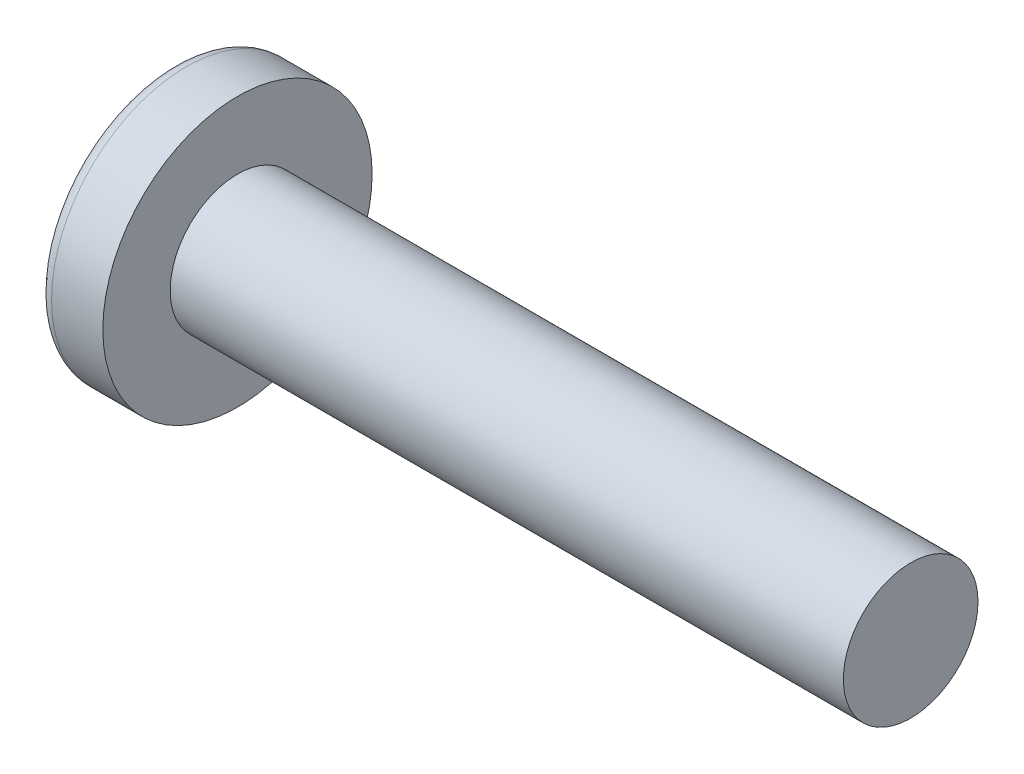
ISO-10303-21;
HEADER;
FILE_DESCRIPTION(('STEP AP214'),'2;1');
FILE_NAME('part.step','',(''),(''),'','','');
FILE_SCHEMA(('AUTOMOTIVE_DESIGN { 1 0 10303 214 1 1 1 1 }'));
ENDSEC;
DATA;
#1=APPLICATION_CONTEXT('core data for automotive mechanical design processes');
#2=APPLICATION_PROTOCOL_DEFINITION('international standard','automotive_design',2000,#1);
#3=PRODUCT_CONTEXT('',#1,'mechanical');
#4=PRODUCT('Part','Part','',(#3));
#5=PRODUCT_RELATED_PRODUCT_CATEGORY('part','',(#4));
#6=PRODUCT_DEFINITION_FORMATION('','',#4);
#7=PRODUCT_DEFINITION_CONTEXT('part definition',#1,'design');
#8=PRODUCT_DEFINITION('design','',#6,#7);
#9=PRODUCT_DEFINITION_SHAPE('','',#8);
#10=(LENGTH_UNIT() NAMED_UNIT(*) SI_UNIT(.MILLI.,.METRE.));
#11=(NAMED_UNIT(*) PLANE_ANGLE_UNIT() SI_UNIT($,.RADIAN.));
#12=(NAMED_UNIT(*) SI_UNIT($,.STERADIAN.) SOLID_ANGLE_UNIT());
#13=UNCERTAINTY_MEASURE_WITH_UNIT(LENGTH_MEASURE(1.E-05),#10,'distance_accuracy_value','');
#14=(GEOMETRIC_REPRESENTATION_CONTEXT(3) GLOBAL_UNCERTAINTY_ASSIGNED_CONTEXT((#13)) GLOBAL_UNIT_ASSIGNED_CONTEXT((#10,
#11,#12)) REPRESENTATION_CONTEXT('',''));
#15=CARTESIAN_POINT('',(0.,0.,0.));
#16=DIRECTION('',(0.,0.,1.));
#17=DIRECTION('',(1.,0.,0.));
#18=AXIS2_PLACEMENT_3D('',#15,#16,#17);
#19=CARTESIAN_POINT('',(0.,0.,-0.5));
#20=DIRECTION('',(0.,0.,-1.));
#21=DIRECTION('',(-1.,0.,0.));
#22=AXIS2_PLACEMENT_3D('',#19,#20,#21);
#23=PLANE('',#22);
#24=DIRECTION('',(1.,0.,0.));
#25=VECTOR('',#24,1.);
#26=CARTESIAN_POINT('',(-23.06142399166,-0.687386354243376,-0.5));
#27=LINE('',#26,#25);
#28=CARTESIAN_POINT('',(-23.0441834238327,-0.687386354243377,-0.5));
#29=VERTEX_POINT('',#28);
#30=CARTESIAN_POINT('',(-20.8,-0.687386354243376,-0.5));
#31=VERTEX_POINT('',#30);
#32=EDGE_CURVE('E283',#29,#31,#27,.T.);
#33=ORIENTED_EDGE('',*,*,#32,.F.);
#34=CARTESIAN_POINT('',(-16.6,0.,-0.5));
#35=DIRECTION('',(0.,0.,-1.));
#36=DIRECTION('',(-1.,0.,0.));
#37=AXIS2_PLACEMENT_3D('',#34,#35,#36);
#38=CIRCLE('',#37,6.48074069840786);
#39=CARTESIAN_POINT('',(-22.7701369230687,-1.98227403518901,-0.5));
#40=VERTEX_POINT('',#39);
#41=EDGE_CURVE('E256',#29,#40,#38,.F.);
#42=ORIENTED_EDGE('',*,*,#41,.T.);
#43=DIRECTION('',(0.894934361602028,0.446197813109803,0.));
#44=VECTOR('',#43,1.);
#45=CARTESIAN_POINT('',(-20.8,-1.,-0.5));
#46=LINE('',#45,#44);
#47=CARTESIAN_POINT('',(-20.8,-1.,-0.5));
#48=VERTEX_POINT('',#47);
#49=EDGE_CURVE('E216',#40,#48,#46,.T.);
#50=ORIENTED_EDGE('',*,*,#49,.T.);
#51=DIRECTION('',(0.,1.,0.));
#52=VECTOR('',#51,1.);
#53=CARTESIAN_POINT('',(-20.8,1.,-0.5));
#54=LINE('',#53,#52);
#55=EDGE_CURVE('E209',#48,#31,#54,.T.);
#56=ORIENTED_EDGE('',*,*,#55,.T.);
#57=EDGE_LOOP('',(#33,#42,#50,#56));
#58=FACE_BOUND('',#57,.T.);
#59=ADVANCED_FACE('F41',(#58),#23,.F.);
#60=CARTESIAN_POINT('',(0.,0.,0.5));
#61=DIRECTION('',(0.,0.,-1.));
#62=DIRECTION('',(-1.,0.,0.));
#63=AXIS2_PLACEMENT_3D('',#60,#61,#62);
#64=PLANE('',#63);
#65=CARTESIAN_POINT('',(-16.6,0.,0.5));
#66=DIRECTION('',(0.,0.,-1.));
#67=DIRECTION('',(-1.,0.,0.));
#68=AXIS2_PLACEMENT_3D('',#65,#66,#67);
#69=CIRCLE('',#68,6.48074069840786);
#70=CARTESIAN_POINT('',(-23.0441834238327,-0.687386354243377,0.5));
#71=VERTEX_POINT('',#70);
#72=CARTESIAN_POINT('',(-22.7701369230687,-1.98227403518901,0.5));
#73=VERTEX_POINT('',#72);
#74=EDGE_CURVE('E247',#71,#73,#69,.F.);
#75=ORIENTED_EDGE('',*,*,#74,.F.);
#76=DIRECTION('',(1.,0.,0.));
#77=VECTOR('',#76,1.);
#78=CARTESIAN_POINT('',(-23.06142399166,-0.687386354243376,0.5));
#79=LINE('',#78,#77);
#80=CARTESIAN_POINT('',(-20.8,-0.687386354243376,0.5));
#81=VERTEX_POINT('',#80);
#82=EDGE_CURVE('E189',#71,#81,#79,.T.);
#83=ORIENTED_EDGE('',*,*,#82,.T.);
#84=DIRECTION('',(0.,1.,0.));
#85=VECTOR('',#84,1.);
#86=CARTESIAN_POINT('',(-20.8,1.,0.5));
#87=LINE('',#86,#85);
#88=CARTESIAN_POINT('',(-20.8,-1.,0.5));
#89=VERTEX_POINT('',#88);
#90=EDGE_CURVE('E219',#89,#81,#87,.T.);
#91=ORIENTED_EDGE('',*,*,#90,.F.);
#92=DIRECTION('',(0.894934361602028,0.446197813109803,0.));
#93=VECTOR('',#92,1.);
#94=CARTESIAN_POINT('',(-20.8,-1.,0.5));
#95=LINE('',#94,#93);
#96=EDGE_CURVE('E225',#73,#89,#95,.T.);
#97=ORIENTED_EDGE('',*,*,#96,.F.);
#98=EDGE_LOOP('',(#75,#83,#91,#97));
#99=FACE_BOUND('',#98,.T.);
#100=ADVANCED_FACE('F327',(#99),#64,.T.);
#101=CARTESIAN_POINT('',(-16.6,0.,0.));
#102=DIRECTION('',(1.,0.,0.));
#103=DIRECTION('',(0.,1.,0.));
#104=AXIS2_PLACEMENT_3D('',#101,#102,#103);
#105=SPHERICAL_SURFACE('',#104,6.5);
#106=CARTESIAN_POINT('',(-21.8473422714487,0.,0.));
#107=DIRECTION('',(1.,0.,0.));
#108=DIRECTION('',(0.,0.,-1.));
#109=AXIS2_PLACEMENT_3D('',#106,#107,#108);
#110=CIRCLE('',#109,3.83606557377049);
#111=CARTESIAN_POINT('',(-21.8473422714487,0.,-3.83606557377049));
#112=VERTEX_POINT('',#111);
#113=EDGE_CURVE('E230',#112,#112,#110,.T.);
#114=ORIENTED_EDGE('',*,*,#113,.F.);
#115=EDGE_LOOP('',(#114));
#116=FACE_BOUND('',#115,.T.);
#117=CARTESIAN_POINT('',(-16.6,0.5,0.));
#118=DIRECTION('',(0.,1.,0.));
#119=DIRECTION('',(0.,0.,1.));
#120=AXIS2_PLACEMENT_3D('',#117,#118,#119);
#121=CIRCLE('',#120,6.48074069840786);
#122=CARTESIAN_POINT('',(-23.0441834238327,0.500000000000002,-0.687386354243374));
#123=VERTEX_POINT('',#122);
#124=CARTESIAN_POINT('',(-22.7701369230687,0.500000000000007,-1.98227403518901));
#125=VERTEX_POINT('',#124);
#126=EDGE_CURVE('E208',#123,#125,#121,.F.);
#127=ORIENTED_EDGE('',*,*,#126,.F.);
#128=CARTESIAN_POINT('',(-23.0441834238327,0.,0.));
#129=DIRECTION('',(1.,0.,0.));
#130=DIRECTION('',(0.,0.,-1.));
#131=AXIS2_PLACEMENT_3D('',#128,#129,#130);
#132=CIRCLE('',#131,0.85);
#133=CARTESIAN_POINT('',(-23.0441834238327,0.687386354243375,-0.5));
#134=VERTEX_POINT('',#133);
#135=EDGE_CURVE('E271',#123,#134,#132,.T.);
#136=ORIENTED_EDGE('',*,*,#135,.T.);
#137=CARTESIAN_POINT('',(-22.7701369230687,1.98227403518901,-0.5));
#138=VERTEX_POINT('',#137);
#139=EDGE_CURVE('E257',#138,#134,#38,.F.);
#140=ORIENTED_EDGE('',*,*,#139,.F.);
#141=CARTESIAN_POINT('',(-17.036870696357,-0.876227059523271,0.));
#142=DIRECTION('',(0.446197813109803,0.894934361602028,0.));
#143=DIRECTION('',(-0.894934361602028,0.446197813109803,0.));
#144=AXIS2_PLACEMENT_3D('',#141,#142,#143);
#145=CIRCLE('',#144,6.42583614285516);
#146=CARTESIAN_POINT('',(-22.7701369230687,1.98227403518901,0.5));
#147=VERTEX_POINT('',#146);
#148=EDGE_CURVE('E251',#147,#138,#145,.F.);
#149=ORIENTED_EDGE('',*,*,#148,.F.);
#150=CARTESIAN_POINT('',(-23.0441834238327,0.687386354243375,0.5));
#151=VERTEX_POINT('',#150);
#152=EDGE_CURVE('E248',#147,#151,#69,.F.);
#153=ORIENTED_EDGE('',*,*,#152,.T.);
#154=CARTESIAN_POINT('',(-23.0441834238327,0.499999999999998,0.687386354243378));
#155=VERTEX_POINT('',#154);
#156=EDGE_CURVE('E172',#151,#155,#132,.T.);
#157=ORIENTED_EDGE('',*,*,#156,.T.);
#158=CARTESIAN_POINT('',(-22.7701369230687,0.499999999999993,1.98227403518901));
#159=VERTEX_POINT('',#158);
#160=EDGE_CURVE('E171',#159,#155,#121,.F.);
#161=ORIENTED_EDGE('',*,*,#160,.F.);
#162=CARTESIAN_POINT('',(-17.036870696357,0.,-0.87622705952327));
#163=DIRECTION('',(0.446197813109803,0.,0.894934361602028));
#164=DIRECTION('',(0.894934361602028,0.,-0.446197813109803));
#165=AXIS2_PLACEMENT_3D('',#162,#163,#164);
#166=CIRCLE('',#165,6.42583614285516);
#167=CARTESIAN_POINT('',(-22.7701369230687,-0.500000000000007,1.98227403518901));
#168=VERTEX_POINT('',#167);
#169=EDGE_CURVE('E49',#168,#159,#166,.F.);
#170=ORIENTED_EDGE('',*,*,#169,.F.);
#171=CARTESIAN_POINT('',(-16.6,-0.5,0.));
#172=DIRECTION('',(0.,1.,0.));
#173=DIRECTION('',(0.,0.,1.));
#174=AXIS2_PLACEMENT_3D('',#171,#172,#173);
#175=CIRCLE('',#174,6.48074069840786);
#176=CARTESIAN_POINT('',(-23.0441834238327,-0.500000000000002,0.687386354243374));
#177=VERTEX_POINT('',#176);
#178=EDGE_CURVE('E202',#168,#177,#175,.F.);
#179=ORIENTED_EDGE('',*,*,#178,.T.);
#180=EDGE_CURVE('E272',#177,#71,#132,.T.);
#181=ORIENTED_EDGE('',*,*,#180,.T.);
#182=ORIENTED_EDGE('',*,*,#74,.T.);
#183=CARTESIAN_POINT('',(-17.036870696357,0.87622705952327,0.));
#184=DIRECTION('',(0.446197813109803,-0.894934361602028,0.));
#185=DIRECTION('',(0.894934361602028,0.446197813109803,0.));
#186=AXIS2_PLACEMENT_3D('',#183,#184,#185);
#187=CIRCLE('',#186,6.42583614285516);
#188=EDGE_CURVE('E253',#40,#73,#187,.F.);
#189=ORIENTED_EDGE('',*,*,#188,.F.);
#190=ORIENTED_EDGE('',*,*,#41,.F.);
#191=CARTESIAN_POINT('',(-23.0441834238327,-0.499999999999998,-0.687386354243378));
#192=VERTEX_POINT('',#191);
#193=EDGE_CURVE('E162',#29,#192,#132,.T.);
#194=ORIENTED_EDGE('',*,*,#193,.T.);
#195=CARTESIAN_POINT('',(-22.7701369230687,-0.499999999999993,-1.98227403518901));
#196=VERTEX_POINT('',#195);
#197=EDGE_CURVE('E206',#192,#196,#175,.F.);
#198=ORIENTED_EDGE('',*,*,#197,.T.);
#199=CARTESIAN_POINT('',(-17.036870696357,0.,0.87622705952327));
#200=DIRECTION('',(0.446197813109803,0.,-0.894934361602028));
#201=DIRECTION('',(-0.894934361602028,0.,-0.446197813109803));
#202=AXIS2_PLACEMENT_3D('',#199,#200,#201);
#203=CIRCLE('',#202,6.42583614285516);
#204=EDGE_CURVE('E260',#125,#196,#203,.F.);
#205=ORIENTED_EDGE('',*,*,#204,.F.);
#206=EDGE_LOOP('',(#127,#136,#140,#149,#153,#157,#161,#170,#179,#181,#182,#189,#190,#194,#198,#205));
#207=FACE_BOUND('',#206,.T.);
#208=ADVANCED_FACE('F268',(#116,#207),#105,.T.);
#209=DIRECTION('',(1.,0.,0.));
#210=VECTOR('',#209,1.);
#211=CARTESIAN_POINT('',(-23.06142399166,0.687386354243376,-0.5));
#212=LINE('',#211,#210);
#213=CARTESIAN_POINT('',(-20.8,0.687386354243376,-0.5));
#214=VERTEX_POINT('',#213);
#215=EDGE_CURVE('E173',#214,#134,#212,.F.);
#216=ORIENTED_EDGE('',*,*,#215,.F.);
#217=CARTESIAN_POINT('',(-20.8,1.,-0.5));
#218=VERTEX_POINT('',#217);
#219=EDGE_CURVE('E213',#214,#218,#54,.T.);
#220=ORIENTED_EDGE('',*,*,#219,.T.);
#221=DIRECTION('',(-0.894934361602028,0.446197813109803,0.));
#222=VECTOR('',#221,1.);
#223=CARTESIAN_POINT('',(-20.8,1.,-0.5));
#224=LINE('',#223,#222);
#225=EDGE_CURVE('E212',#218,#138,#224,.T.);
#226=ORIENTED_EDGE('',*,*,#225,.T.);
#227=ORIENTED_EDGE('',*,*,#139,.T.);
#228=EDGE_LOOP('',(#216,#220,#226,#227));
#229=FACE_BOUND('',#228,.T.);
#230=ADVANCED_FACE('F298',(#229),#23,.F.);
#231=CARTESIAN_POINT('',(-20.8,0.687386354243376,0.5));
#232=VERTEX_POINT('',#231);
#233=CARTESIAN_POINT('',(-20.8,1.,0.5));
#234=VERTEX_POINT('',#233);
#235=EDGE_CURVE('E222',#232,#234,#87,.T.);
#236=ORIENTED_EDGE('',*,*,#235,.F.);
#237=DIRECTION('',(1.,0.,0.));
#238=VECTOR('',#237,1.);
#239=CARTESIAN_POINT('',(-23.06142399166,0.687386354243376,0.5));
#240=LINE('',#239,#238);
#241=EDGE_CURVE('E159',#232,#151,#240,.F.);
#242=ORIENTED_EDGE('',*,*,#241,.T.);
#243=ORIENTED_EDGE('',*,*,#152,.F.);
#244=DIRECTION('',(-0.894934361602028,0.446197813109803,0.));
#245=VECTOR('',#244,1.);
#246=CARTESIAN_POINT('',(-20.8,1.,0.5));
#247=LINE('',#246,#245);
#248=EDGE_CURVE('E221',#234,#147,#247,.T.);
#249=ORIENTED_EDGE('',*,*,#248,.F.);
#250=EDGE_LOOP('',(#236,#242,#243,#249));
#251=FACE_BOUND('',#250,.T.);
#252=ADVANCED_FACE('F305',(#251),#64,.T.);
#253=CARTESIAN_POINT('',(0.,-0.5,0.));
#254=DIRECTION('',(0.,1.,0.));
#255=DIRECTION('',(-1.,0.,0.));
#256=AXIS2_PLACEMENT_3D('',#253,#254,#255);
#257=PLANE('',#256);
#258=DIRECTION('',(0.,0.,1.));
#259=VECTOR('',#258,1.);
#260=CARTESIAN_POINT('',(-20.8,-0.500000000000003,0.999999999999998));
#261=LINE('',#260,#259);
#262=CARTESIAN_POINT('',(-20.8,-0.500000000000002,0.687386354243374));
#263=VERTEX_POINT('',#262);
#264=CARTESIAN_POINT('',(-20.8,-0.500000000000003,0.999999999999998));
#265=VERTEX_POINT('',#264);
#266=EDGE_CURVE('E196',#263,#265,#261,.T.);
#267=ORIENTED_EDGE('',*,*,#266,.F.);
#268=DIRECTION('',(1.,0.,0.));
#269=VECTOR('',#268,1.);
#270=CARTESIAN_POINT('',(-23.06142399166,-0.500000000000002,0.687386354243374));
#271=LINE('',#270,#269);
#272=EDGE_CURVE('E273',#263,#177,#271,.F.);
#273=ORIENTED_EDGE('',*,*,#272,.T.);
#274=ORIENTED_EDGE('',*,*,#178,.F.);
#275=DIRECTION('',(-0.894934361602028,0.,0.446197813109803));
#276=VECTOR('',#275,1.);
#277=CARTESIAN_POINT('',(-20.8,-0.500000000000003,0.999999999999998));
#278=LINE('',#277,#276);
#279=EDGE_CURVE('E185',#265,#168,#278,.T.);
#280=ORIENTED_EDGE('',*,*,#279,.F.);
#281=EDGE_LOOP('',(#267,#273,#274,#280));
#282=FACE_BOUND('',#281,.T.);
#283=ADVANCED_FACE('F332',(#282),#257,.T.);
#284=CARTESIAN_POINT('',(0.,0.5,0.));
#285=DIRECTION('',(0.,1.,0.));
#286=DIRECTION('',(-1.,0.,0.));
#287=AXIS2_PLACEMENT_3D('',#284,#285,#286);
#288=PLANE('',#287);
#289=DIRECTION('',(1.,0.,0.));
#290=VECTOR('',#289,1.);
#291=CARTESIAN_POINT('',(-23.06142399166,0.499999999999998,0.687386354243378));
#292=LINE('',#291,#290);
#293=CARTESIAN_POINT('',(-20.8,0.499999999999998,0.687386354243378));
#294=VERTEX_POINT('',#293);
#295=EDGE_CURVE('E156',#294,#155,#292,.F.);
#296=ORIENTED_EDGE('',*,*,#295,.F.);
#297=DIRECTION('',(0.,0.,1.));
#298=VECTOR('',#297,1.);
#299=CARTESIAN_POINT('',(-20.8,0.499999999999997,1.));
#300=LINE('',#299,#298);
#301=CARTESIAN_POINT('',(-20.8,0.499999999999997,1.));
#302=VERTEX_POINT('',#301);
#303=EDGE_CURVE('E168',#294,#302,#300,.T.);
#304=ORIENTED_EDGE('',*,*,#303,.T.);
#305=DIRECTION('',(-0.894934361602028,0.,0.446197813109803));
#306=VECTOR('',#305,1.);
#307=CARTESIAN_POINT('',(-20.8,0.499999999999997,1.));
#308=LINE('',#307,#306);
#309=EDGE_CURVE('E184',#302,#159,#308,.T.);
#310=ORIENTED_EDGE('',*,*,#309,.T.);
#311=ORIENTED_EDGE('',*,*,#160,.T.);
#312=EDGE_LOOP('',(#296,#304,#310,#311));
#313=FACE_BOUND('',#312,.T.);
#314=ADVANCED_FACE('F166',(#313),#288,.F.);
#315=DIRECTION('',(1.,0.,0.));
#316=VECTOR('',#315,1.);
#317=CARTESIAN_POINT('',(-23.06142399166,0.500000000000002,-0.687386354243374));
#318=LINE('',#317,#316);
#319=CARTESIAN_POINT('',(-20.8,0.500000000000002,-0.687386354243374));
#320=VERTEX_POINT('',#319);
#321=EDGE_CURVE('E277',#123,#320,#318,.T.);
#322=ORIENTED_EDGE('',*,*,#321,.F.);
#323=ORIENTED_EDGE('',*,*,#126,.T.);
#324=DIRECTION('',(0.894934361602028,0.,0.446197813109803));
#325=VECTOR('',#324,1.);
#326=CARTESIAN_POINT('',(-20.8,0.500000000000003,-0.999999999999998));
#327=LINE('',#326,#325);
#328=CARTESIAN_POINT('',(-20.8,0.500000000000003,-0.999999999999998));
#329=VERTEX_POINT('',#328);
#330=EDGE_CURVE('E192',#125,#329,#327,.T.);
#331=ORIENTED_EDGE('',*,*,#330,.T.);
#332=EDGE_CURVE('E180',#329,#320,#300,.T.);
#333=ORIENTED_EDGE('',*,*,#332,.T.);
#334=EDGE_LOOP('',(#322,#323,#331,#333));
#335=FACE_BOUND('',#334,.T.);
#336=ADVANCED_FACE('F308',(#335),#288,.F.);
#337=ORIENTED_EDGE('',*,*,#197,.F.);
#338=DIRECTION('',(1.,0.,0.));
#339=VECTOR('',#338,1.);
#340=CARTESIAN_POINT('',(-23.06142399166,-0.499999999999998,-0.687386354243378));
#341=LINE('',#340,#339);
#342=CARTESIAN_POINT('',(-20.8,-0.499999999999998,-0.687386354243378));
#343=VERTEX_POINT('',#342);
#344=EDGE_CURVE('E11',#192,#343,#341,.T.);
#345=ORIENTED_EDGE('',*,*,#344,.T.);
#346=CARTESIAN_POINT('',(-20.8,-0.499999999999997,-1.));
#347=VERTEX_POINT('',#346);
#348=EDGE_CURVE('E194',#347,#343,#261,.T.);
#349=ORIENTED_EDGE('',*,*,#348,.F.);
#350=DIRECTION('',(0.894934361602028,0.,0.446197813109803));
#351=VECTOR('',#350,1.);
#352=CARTESIAN_POINT('',(-20.8,-0.499999999999997,-1.));
#353=LINE('',#352,#351);
#354=EDGE_CURVE('E181',#196,#347,#353,.T.);
#355=ORIENTED_EDGE('',*,*,#354,.F.);
#356=EDGE_LOOP('',(#337,#345,#349,#355));
#357=FACE_BOUND('',#356,.T.);
#358=ADVANCED_FACE('F314',(#357),#257,.T.);
#359=CARTESIAN_POINT('',(0.,0.,0.));
#360=DIRECTION('',(1.,0.,0.));
#361=DIRECTION('',(0.,0.,-1.));
#362=AXIS2_PLACEMENT_3D('',#359,#360,#361);
#363=PLANE('',#362);
#364=CARTESIAN_POINT('',(0.,0.,0.));
#365=DIRECTION('',(1.,0.,0.));
#366=DIRECTION('',(0.,0.,-1.));
#367=AXIS2_PLACEMENT_3D('',#364,#365,#366);
#368=CIRCLE('',#367,2.);
#369=CARTESIAN_POINT('',(0.,0.,-2.));
#370=VERTEX_POINT('',#369);
#371=EDGE_CURVE('E244',#370,#370,#368,.T.);
#372=ORIENTED_EDGE('',*,*,#371,.T.);
#373=EDGE_LOOP('',(#372));
#374=FACE_BOUND('',#373,.T.);
#375=ADVANCED_FACE('F43',(#374),#363,.T.);
#376=CARTESIAN_POINT('',(0.,0.,0.));
#377=DIRECTION('',(1.,0.,0.));
#378=DIRECTION('',(0.,0.,-1.));
#379=AXIS2_PLACEMENT_3D('',#376,#377,#378);
#380=CYLINDRICAL_SURFACE('',#379,2.);
#381=CARTESIAN_POINT('',(-20.,0.,0.));
#382=DIRECTION('',(1.,0.,0.));
#383=DIRECTION('',(0.,0.,-1.));
#384=AXIS2_PLACEMENT_3D('',#381,#382,#383);
#385=CIRCLE('',#384,2.);
#386=CARTESIAN_POINT('',(-20.,0.,-2.));
#387=VERTEX_POINT('',#386);
#388=EDGE_CURVE('E241',#387,#387,#385,.T.);
#389=ORIENTED_EDGE('',*,*,#388,.T.);
#390=EDGE_LOOP('',(#389));
#391=FACE_BOUND('',#390,.T.);
#392=ORIENTED_EDGE('',*,*,#371,.F.);
#393=EDGE_LOOP('',(#392));
#394=FACE_BOUND('',#393,.T.);
#395=ADVANCED_FACE('F371',(#391,#394),#380,.T.);
#396=CARTESIAN_POINT('',(-20.,2.,0.));
#397=DIRECTION('',(1.,0.,0.));
#398=DIRECTION('',(0.,0.,-1.));
#399=AXIS2_PLACEMENT_3D('',#396,#397,#398);
#400=PLANE('',#399);
#401=CARTESIAN_POINT('',(-20.,0.,0.));
#402=DIRECTION('',(1.,0.,0.));
#403=DIRECTION('',(0.,0.,-1.));
#404=AXIS2_PLACEMENT_3D('',#401,#402,#403);
#405=CIRCLE('',#404,4.);
#406=CARTESIAN_POINT('',(-20.,0.,-4.));
#407=VERTEX_POINT('',#406);
#408=EDGE_CURVE('E238',#407,#407,#405,.T.);
#409=ORIENTED_EDGE('',*,*,#408,.T.);
#410=EDGE_LOOP('',(#409));
#411=FACE_BOUND('',#410,.T.);
#412=ORIENTED_EDGE('',*,*,#388,.F.);
#413=EDGE_LOOP('',(#412));
#414=FACE_BOUND('',#413,.T.);
#415=ADVANCED_FACE('F368',(#411,#414),#400,.T.);
#416=CARTESIAN_POINT('',(0.,0.,0.));
#417=DIRECTION('',(1.,0.,0.));
#418=DIRECTION('',(0.,0.,-1.));
#419=AXIS2_PLACEMENT_3D('',#416,#417,#418);
#420=CYLINDRICAL_SURFACE('',#419,4.);
#421=CARTESIAN_POINT('',(-21.5244289008981,0.,0.));
#422=DIRECTION('',(1.,0.,0.));
#423=DIRECTION('',(0.,0.,-1.));
#424=AXIS2_PLACEMENT_3D('',#421,#422,#423);
#425=CIRCLE('',#424,4.);
#426=CARTESIAN_POINT('',(-21.5244289008981,0.,-4.));
#427=VERTEX_POINT('',#426);
#428=EDGE_CURVE('E235',#427,#427,#425,.T.);
#429=ORIENTED_EDGE('',*,*,#428,.T.);
#430=EDGE_LOOP('',(#429));
#431=FACE_BOUND('',#430,.T.);
#432=ORIENTED_EDGE('',*,*,#408,.F.);
#433=EDGE_LOOP('',(#432));
#434=FACE_BOUND('',#433,.T.);
#435=ADVANCED_FACE('F364',(#431,#434),#420,.T.);
#436=CARTESIAN_POINT('',(-21.5244289008981,0.,0.));
#437=DIRECTION('',(1.,0.,0.));
#438=DIRECTION('',(0.,0.,-1.));
#439=AXIS2_PLACEMENT_3D('',#436,#437,#438);
#440=TOROIDAL_SURFACE('',#439,3.6,0.400000000000001);
#441=ORIENTED_EDGE('',*,*,#113,.T.);
#442=EDGE_LOOP('',(#441));
#443=FACE_BOUND('',#442,.T.);
#444=ORIENTED_EDGE('',*,*,#428,.F.);
#445=EDGE_LOOP('',(#444));
#446=FACE_BOUND('',#445,.T.);
#447=ADVANCED_FACE('F361',(#443,#446),#440,.T.);
#448=CARTESIAN_POINT('',(-20.8,1.,-0.5));
#449=DIRECTION('',(1.,0.,0.));
#450=DIRECTION('',(0.,0.,-1.));
#451=AXIS2_PLACEMENT_3D('',#448,#449,#450);
#452=PLANE('',#451);
#453=ORIENTED_EDGE('',*,*,#348,.T.);
#454=CARTESIAN_POINT('',(-20.8,0.,0.));
#455=DIRECTION('',(-1.,0.,0.));
#456=DIRECTION('',(0.,0.,1.));
#457=AXIS2_PLACEMENT_3D('',#454,#455,#456);
#458=CIRCLE('',#457,0.85);
#459=EDGE_CURVE('E317',#343,#31,#458,.T.);
#460=ORIENTED_EDGE('',*,*,#459,.T.);
#461=ORIENTED_EDGE('',*,*,#55,.F.);
#462=DIRECTION('',(0.,0.,1.));
#463=VECTOR('',#462,1.);
#464=CARTESIAN_POINT('',(-20.8,-1.,-0.5));
#465=LINE('',#464,#463);
#466=EDGE_CURVE('E227',#48,#89,#465,.T.);
#467=ORIENTED_EDGE('',*,*,#466,.T.);
#468=ORIENTED_EDGE('',*,*,#90,.T.);
#469=EDGE_CURVE('E56',#81,#263,#458,.T.);
#470=ORIENTED_EDGE('',*,*,#469,.T.);
#471=ORIENTED_EDGE('',*,*,#266,.T.);
#472=DIRECTION('',(0.,-1.,0.));
#473=VECTOR('',#472,1.);
#474=CARTESIAN_POINT('',(-20.8,0.499999999999997,1.));
#475=LINE('',#474,#473);
#476=EDGE_CURVE('E178',#302,#265,#475,.T.);
#477=ORIENTED_EDGE('',*,*,#476,.F.);
#478=ORIENTED_EDGE('',*,*,#303,.F.);
#479=EDGE_CURVE('E153',#294,#232,#458,.T.);
#480=ORIENTED_EDGE('',*,*,#479,.T.);
#481=ORIENTED_EDGE('',*,*,#235,.T.);
#482=DIRECTION('',(0.,0.,1.));
#483=VECTOR('',#482,1.);
#484=CARTESIAN_POINT('',(-20.8,1.,-0.5));
#485=LINE('',#484,#483);
#486=EDGE_CURVE('E218',#218,#234,#485,.T.);
#487=ORIENTED_EDGE('',*,*,#486,.F.);
#488=ORIENTED_EDGE('',*,*,#219,.F.);
#489=EDGE_CURVE('E63',#214,#320,#458,.T.);
#490=ORIENTED_EDGE('',*,*,#489,.T.);
#491=ORIENTED_EDGE('',*,*,#332,.F.);
#492=DIRECTION('',(0.,-1.,0.));
#493=VECTOR('',#492,1.);
#494=CARTESIAN_POINT('',(-20.8,0.500000000000003,-0.999999999999998));
#495=LINE('',#494,#493);
#496=EDGE_CURVE('E199',#329,#347,#495,.T.);
#497=ORIENTED_EDGE('',*,*,#496,.T.);
#498=EDGE_LOOP('',(#453,#460,#461,#467,#468,#470,#471,#477,#478,#480,#481,#487,#488,#490,#491,#497));
#499=FACE_BOUND('',#498,.T.);
#500=ADVANCED_FACE('F176',(#499),#452,.F.);
#501=CARTESIAN_POINT('',(-20.8,-1.,-0.5));
#502=DIRECTION('',(0.446197813109803,-0.894934361602028,0.));
#503=DIRECTION('',(0.894934361602028,0.446197813109803,0.));
#504=AXIS2_PLACEMENT_3D('',#501,#502,#503);
#505=PLANE('',#504);
#506=ORIENTED_EDGE('',*,*,#188,.T.);
#507=ORIENTED_EDGE('',*,*,#96,.T.);
#508=ORIENTED_EDGE('',*,*,#466,.F.);
#509=ORIENTED_EDGE('',*,*,#49,.F.);
#510=EDGE_LOOP('',(#506,#507,#508,#509));
#511=FACE_BOUND('',#510,.T.);
#512=ADVANCED_FACE('F323',(#511),#505,.F.);
#513=CARTESIAN_POINT('',(-20.8,1.,-0.5));
#514=DIRECTION('',(0.446197813109803,0.894934361602028,0.));
#515=DIRECTION('',(-0.894934361602028,0.446197813109803,0.));
#516=AXIS2_PLACEMENT_3D('',#513,#514,#515);
#517=PLANE('',#516);
#518=ORIENTED_EDGE('',*,*,#148,.T.);
#519=ORIENTED_EDGE('',*,*,#225,.F.);
#520=ORIENTED_EDGE('',*,*,#486,.T.);
#521=ORIENTED_EDGE('',*,*,#248,.T.);
#522=EDGE_LOOP('',(#518,#519,#520,#521));
#523=FACE_BOUND('',#522,.T.);
#524=ADVANCED_FACE('F302',(#523),#517,.F.);
#525=CARTESIAN_POINT('',(-20.8,0.499999999999997,1.));
#526=DIRECTION('',(0.446197813109803,0.,0.894934361602028));
#527=DIRECTION('',(0.894934361602028,0.,-0.446197813109803));
#528=AXIS2_PLACEMENT_3D('',#525,#526,#527);
#529=PLANE('',#528);
#530=ORIENTED_EDGE('',*,*,#169,.T.);
#531=ORIENTED_EDGE('',*,*,#309,.F.);
#532=ORIENTED_EDGE('',*,*,#476,.T.);
#533=ORIENTED_EDGE('',*,*,#279,.T.);
#534=EDGE_LOOP('',(#530,#531,#532,#533));
#535=FACE_BOUND('',#534,.T.);
#536=ADVANCED_FACE('F264',(#535),#529,.F.);
#537=CARTESIAN_POINT('',(-20.8,0.500000000000003,-0.999999999999998));
#538=DIRECTION('',(0.446197813109803,0.,-0.894934361602028));
#539=DIRECTION('',(-0.894934361602028,0.,-0.446197813109803));
#540=AXIS2_PLACEMENT_3D('',#537,#538,#539);
#541=PLANE('',#540);
#542=ORIENTED_EDGE('',*,*,#204,.T.);
#543=ORIENTED_EDGE('',*,*,#354,.T.);
#544=ORIENTED_EDGE('',*,*,#496,.F.);
#545=ORIENTED_EDGE('',*,*,#330,.F.);
#546=EDGE_LOOP('',(#542,#543,#544,#545));
#547=FACE_BOUND('',#546,.T.);
#548=ADVANCED_FACE('F311',(#547),#541,.F.);
#549=CARTESIAN_POINT('',(-23.06142399166,0.,0.));
#550=DIRECTION('',(1.,0.,0.));
#551=DIRECTION('',(0.,0.,-1.));
#552=AXIS2_PLACEMENT_3D('',#549,#550,#551);
#553=CYLINDRICAL_SURFACE('',#552,0.85);
#554=ORIENTED_EDGE('',*,*,#32,.T.);
#555=ORIENTED_EDGE('',*,*,#459,.F.);
#556=ORIENTED_EDGE('',*,*,#344,.F.);
#557=ORIENTED_EDGE('',*,*,#193,.F.);
#558=EDGE_LOOP('',(#554,#555,#556,#557));
#559=FACE_BOUND('',#558,.T.);
#560=ADVANCED_FACE('F438',(#559),#553,.F.);
#561=ORIENTED_EDGE('',*,*,#215,.T.);
#562=ORIENTED_EDGE('',*,*,#135,.F.);
#563=ORIENTED_EDGE('',*,*,#321,.T.);
#564=ORIENTED_EDGE('',*,*,#489,.F.);
#565=EDGE_LOOP('',(#561,#562,#563,#564));
#566=FACE_BOUND('',#565,.T.);
#567=ADVANCED_FACE('F293',(#566),#553,.F.);
#568=ORIENTED_EDGE('',*,*,#479,.F.);
#569=ORIENTED_EDGE('',*,*,#295,.T.);
#570=ORIENTED_EDGE('',*,*,#156,.F.);
#571=ORIENTED_EDGE('',*,*,#241,.F.);
#572=EDGE_LOOP('',(#568,#569,#570,#571));
#573=FACE_BOUND('',#572,.T.);
#574=ADVANCED_FACE('F155',(#573),#553,.F.);
#575=ORIENTED_EDGE('',*,*,#180,.F.);
#576=ORIENTED_EDGE('',*,*,#272,.F.);
#577=ORIENTED_EDGE('',*,*,#469,.F.);
#578=ORIENTED_EDGE('',*,*,#82,.F.);
#579=EDGE_LOOP('',(#575,#576,#577,#578));
#580=FACE_BOUND('',#579,.T.);
#581=ADVANCED_FACE('F329',(#580),#553,.F.);
#582=CLOSED_SHELL('',(#59,#100,#208,#230,#252,#283,#314,#336,#358,#375,#395,#415,#435,#447,#500,
#512,#524,#536,#548,#560,#567,#574,#581));
#583=MANIFOLD_SOLID_BREP('B2',#582);
#584=ADVANCED_BREP_SHAPE_REPRESENTATION('',(#18,#583),#14);
#585=SHAPE_DEFINITION_REPRESENTATION(#9,#584);
ENDSEC;
END-ISO-10303-21;
